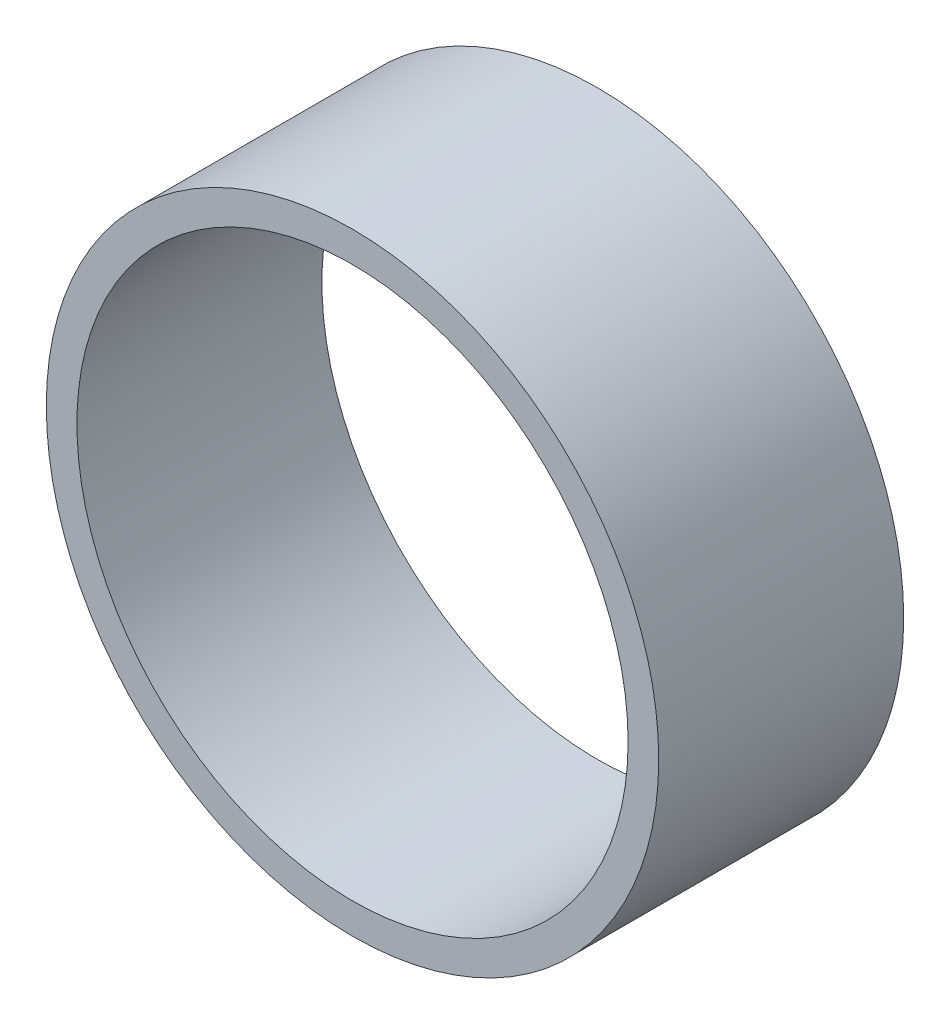
ISO-10303-21;
HEADER;
FILE_DESCRIPTION(('STEP AP214'),'2;1');
FILE_NAME('part.step','',(''),(''),'','','');
FILE_SCHEMA(('AUTOMOTIVE_DESIGN { 1 0 10303 214 1 1 1 1 }'));
ENDSEC;
DATA;
#1=APPLICATION_CONTEXT('core data for automotive mechanical design processes');
#2=APPLICATION_PROTOCOL_DEFINITION('international standard','automotive_design',2000,#1);
#3=PRODUCT_CONTEXT('',#1,'mechanical');
#4=PRODUCT('Part','Part','',(#3));
#5=PRODUCT_RELATED_PRODUCT_CATEGORY('part','',(#4));
#6=PRODUCT_DEFINITION_FORMATION('','',#4);
#7=PRODUCT_DEFINITION_CONTEXT('part definition',#1,'design');
#8=PRODUCT_DEFINITION('design','',#6,#7);
#9=PRODUCT_DEFINITION_SHAPE('','',#8);
#10=(LENGTH_UNIT() NAMED_UNIT(*) SI_UNIT(.MILLI.,.METRE.));
#11=(NAMED_UNIT(*) PLANE_ANGLE_UNIT() SI_UNIT($,.RADIAN.));
#12=(NAMED_UNIT(*) SI_UNIT($,.STERADIAN.) SOLID_ANGLE_UNIT());
#13=UNCERTAINTY_MEASURE_WITH_UNIT(LENGTH_MEASURE(1.E-05),#10,'distance_accuracy_value','');
#14=(GEOMETRIC_REPRESENTATION_CONTEXT(3) GLOBAL_UNCERTAINTY_ASSIGNED_CONTEXT((#13)) GLOBAL_UNIT_ASSIGNED_CONTEXT((#10,
#11,#12)) REPRESENTATION_CONTEXT('',''));
#15=CARTESIAN_POINT('',(0.,0.,0.));
#16=DIRECTION('',(0.,0.,1.));
#17=DIRECTION('',(1.,0.,0.));
#18=AXIS2_PLACEMENT_3D('',#15,#16,#17);
#19=CARTESIAN_POINT('',(0.,0.,8.));
#20=DIRECTION('',(0.,0.,1.));
#21=DIRECTION('',(1.,0.,0.));
#22=AXIS2_PLACEMENT_3D('',#19,#20,#21);
#23=PLANE('',#22);
#24=CARTESIAN_POINT('',(0.,0.,8.));
#25=DIRECTION('',(0.,0.,1.));
#26=DIRECTION('',(1.,0.,0.));
#27=AXIS2_PLACEMENT_3D('',#24,#25,#26);
#28=CIRCLE('',#27,10.);
#29=CARTESIAN_POINT('',(10.,0.,8.));
#30=VERTEX_POINT('',#29);
#31=EDGE_CURVE('E10',#30,#30,#28,.T.);
#32=ORIENTED_EDGE('',*,*,#31,.T.);
#33=EDGE_LOOP('',(#32));
#34=FACE_BOUND('',#33,.T.);
#35=CARTESIAN_POINT('',(0.,0.,8.));
#36=DIRECTION('',(0.,0.,1.));
#37=DIRECTION('',(1.,0.,0.));
#38=AXIS2_PLACEMENT_3D('',#35,#36,#37);
#39=CIRCLE('',#38,9.);
#40=CARTESIAN_POINT('',(9.,0.,8.));
#41=VERTEX_POINT('',#40);
#42=EDGE_CURVE('E48',#41,#41,#39,.T.);
#43=ORIENTED_EDGE('',*,*,#42,.F.);
#44=EDGE_LOOP('',(#43));
#45=FACE_BOUND('',#44,.T.);
#46=ADVANCED_FACE('F37',(#34,#45),#23,.T.);
#47=CARTESIAN_POINT('',(0.,0.,0.));
#48=DIRECTION('',(0.,0.,1.));
#49=DIRECTION('',(1.,0.,0.));
#50=AXIS2_PLACEMENT_3D('',#47,#48,#49);
#51=PLANE('',#50);
#52=CARTESIAN_POINT('',(0.,0.,0.));
#53=DIRECTION('',(0.,0.,1.));
#54=DIRECTION('',(1.,0.,0.));
#55=AXIS2_PLACEMENT_3D('',#52,#53,#54);
#56=CIRCLE('',#55,10.);
#57=CARTESIAN_POINT('',(10.,0.,0.));
#58=VERTEX_POINT('',#57);
#59=EDGE_CURVE('E41',#58,#58,#56,.T.);
#60=ORIENTED_EDGE('',*,*,#59,.F.);
#61=EDGE_LOOP('',(#60));
#62=FACE_BOUND('',#61,.T.);
#63=CARTESIAN_POINT('',(0.,0.,0.));
#64=DIRECTION('',(0.,0.,1.));
#65=DIRECTION('',(1.,0.,0.));
#66=AXIS2_PLACEMENT_3D('',#63,#64,#65);
#67=CIRCLE('',#66,9.);
#68=CARTESIAN_POINT('',(9.,0.,0.));
#69=VERTEX_POINT('',#68);
#70=EDGE_CURVE('E50',#69,#69,#67,.T.);
#71=ORIENTED_EDGE('',*,*,#70,.T.);
#72=EDGE_LOOP('',(#71));
#73=FACE_BOUND('',#72,.T.);
#74=ADVANCED_FACE('F60',(#62,#73),#51,.F.);
#75=CARTESIAN_POINT('',(0.,0.,8.));
#76=DIRECTION('',(0.,0.,-1.));
#77=DIRECTION('',(-1.,0.,0.));
#78=AXIS2_PLACEMENT_3D('',#75,#76,#77);
#79=CYLINDRICAL_SURFACE('',#78,10.);
#80=ORIENTED_EDGE('',*,*,#31,.F.);
#81=EDGE_LOOP('',(#80));
#82=FACE_BOUND('',#81,.T.);
#83=ORIENTED_EDGE('',*,*,#59,.T.);
#84=EDGE_LOOP('',(#83));
#85=FACE_BOUND('',#84,.T.);
#86=ADVANCED_FACE('F39',(#82,#85),#79,.T.);
#87=CARTESIAN_POINT('',(0.,0.,8.));
#88=DIRECTION('',(0.,0.,-1.));
#89=DIRECTION('',(-1.,0.,0.));
#90=AXIS2_PLACEMENT_3D('',#87,#88,#89);
#91=CYLINDRICAL_SURFACE('',#90,9.);
#92=ORIENTED_EDGE('',*,*,#42,.T.);
#93=EDGE_LOOP('',(#92));
#94=FACE_BOUND('',#93,.T.);
#95=ORIENTED_EDGE('',*,*,#70,.F.);
#96=EDGE_LOOP('',(#95));
#97=FACE_BOUND('',#96,.T.);
#98=ADVANCED_FACE('F56',(#94,#97),#91,.F.);
#99=CLOSED_SHELL('',(#46,#74,#86,#98));
#100=MANIFOLD_SOLID_BREP('B2',#99);
#101=ADVANCED_BREP_SHAPE_REPRESENTATION('',(#18,#100),#14);
#102=SHAPE_DEFINITION_REPRESENTATION(#9,#101);
ENDSEC;
END-ISO-10303-21;
